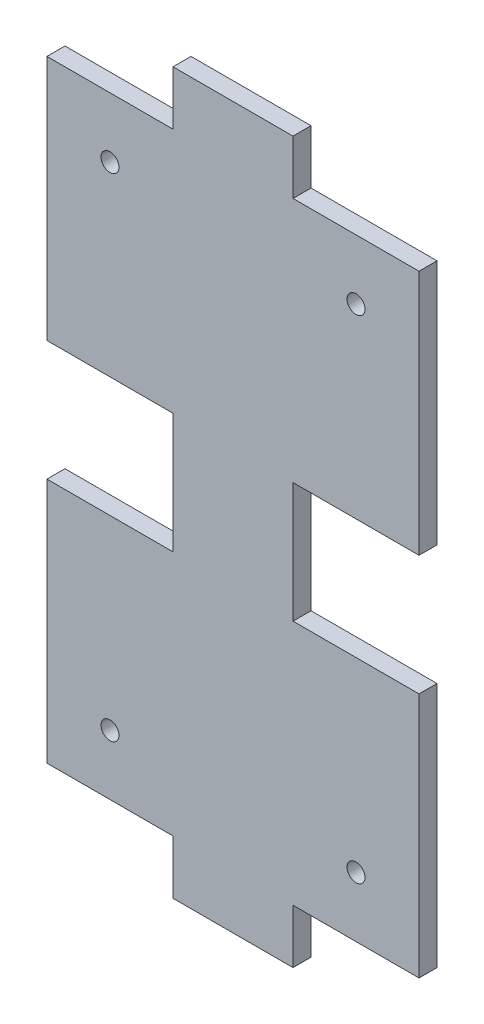
ISO-10303-21;
HEADER;
FILE_DESCRIPTION(('STEP AP214'),'2;1');
FILE_NAME('part.step','',(''),(''),'','','');
FILE_SCHEMA(('AUTOMOTIVE_DESIGN { 1 0 10303 214 1 1 1 1 }'));
ENDSEC;
DATA;
#1=APPLICATION_CONTEXT('core data for automotive mechanical design processes');
#2=APPLICATION_PROTOCOL_DEFINITION('international standard','automotive_design',2000,#1);
#3=PRODUCT_CONTEXT('',#1,'mechanical');
#4=PRODUCT('Part','Part','',(#3));
#5=PRODUCT_RELATED_PRODUCT_CATEGORY('part','',(#4));
#6=PRODUCT_DEFINITION_FORMATION('','',#4);
#7=PRODUCT_DEFINITION_CONTEXT('part definition',#1,'design');
#8=PRODUCT_DEFINITION('design','',#6,#7);
#9=PRODUCT_DEFINITION_SHAPE('','',#8);
#10=(LENGTH_UNIT() NAMED_UNIT(*) SI_UNIT(.MILLI.,.METRE.));
#11=(NAMED_UNIT(*) PLANE_ANGLE_UNIT() SI_UNIT($,.RADIAN.));
#12=(NAMED_UNIT(*) SI_UNIT($,.STERADIAN.) SOLID_ANGLE_UNIT());
#13=UNCERTAINTY_MEASURE_WITH_UNIT(LENGTH_MEASURE(1.E-05),#10,'distance_accuracy_value','');
#14=(GEOMETRIC_REPRESENTATION_CONTEXT(3) GLOBAL_UNCERTAINTY_ASSIGNED_CONTEXT((#13)) GLOBAL_UNIT_ASSIGNED_CONTEXT((#10,
#11,#12)) REPRESENTATION_CONTEXT('',''));
#15=CARTESIAN_POINT('',(0.,0.,0.));
#16=DIRECTION('',(0.,0.,1.));
#17=DIRECTION('',(1.,0.,0.));
#18=AXIS2_PLACEMENT_3D('',#15,#16,#17);
#19=CARTESIAN_POINT('',(31.,0.,3.));
#20=DIRECTION('',(-1.,0.,0.));
#21=DIRECTION('',(0.,0.,1.));
#22=AXIS2_PLACEMENT_3D('',#19,#20,#21);
#23=PLANE('',#22);
#24=DIRECTION('',(0.,1.,0.));
#25=VECTOR('',#24,1.);
#26=CARTESIAN_POINT('',(31.,0.,0.));
#27=LINE('',#26,#25);
#28=CARTESIAN_POINT('',(31.,13.4085885049134,0.));
#29=VERTEX_POINT('',#28);
#30=CARTESIAN_POINT('',(31.,54.4085885049134,0.));
#31=VERTEX_POINT('',#30);
#32=EDGE_CURVE('E221',#29,#31,#27,.T.);
#33=ORIENTED_EDGE('',*,*,#32,.T.);
#34=DIRECTION('',(0.,0.,-1.));
#35=VECTOR('',#34,1.);
#36=CARTESIAN_POINT('',(31.,54.4085885049134,3.));
#37=LINE('',#36,#35);
#38=CARTESIAN_POINT('',(31.,54.4085885049134,3.));
#39=VERTEX_POINT('',#38);
#40=EDGE_CURVE('E11',#39,#31,#37,.T.);
#41=ORIENTED_EDGE('',*,*,#40,.F.);
#42=DIRECTION('',(0.,1.,0.));
#43=VECTOR('',#42,1.);
#44=CARTESIAN_POINT('',(31.,0.,3.));
#45=LINE('',#44,#43);
#46=CARTESIAN_POINT('',(31.,13.4085885049134,3.));
#47=VERTEX_POINT('',#46);
#48=EDGE_CURVE('E362',#47,#39,#45,.T.);
#49=ORIENTED_EDGE('',*,*,#48,.F.);
#50=DIRECTION('',(0.,0.,-1.));
#51=VECTOR('',#50,1.);
#52=CARTESIAN_POINT('',(31.,13.4085885049134,3.));
#53=LINE('',#52,#51);
#54=EDGE_CURVE('E217',#47,#29,#53,.T.);
#55=ORIENTED_EDGE('',*,*,#54,.T.);
#56=EDGE_LOOP('',(#33,#41,#49,#55));
#57=FACE_BOUND('',#56,.T.);
#58=ADVANCED_FACE('F35',(#57),#23,.F.);
#59=CARTESIAN_POINT('',(0.,54.4085885049134,3.));
#60=DIRECTION('',(0.,-1.,0.));
#61=DIRECTION('',(1.,0.,0.));
#62=AXIS2_PLACEMENT_3D('',#59,#60,#61);
#63=PLANE('',#62);
#64=DIRECTION('',(-1.,0.,0.));
#65=VECTOR('',#64,1.);
#66=CARTESIAN_POINT('',(0.,54.4085885049134,0.));
#67=LINE('',#66,#65);
#68=CARTESIAN_POINT('',(10.,54.4085885049134,0.));
#69=VERTEX_POINT('',#68);
#70=EDGE_CURVE('E224',#31,#69,#67,.T.);
#71=ORIENTED_EDGE('',*,*,#70,.T.);
#72=DIRECTION('',(0.,0.,-1.));
#73=VECTOR('',#72,1.);
#74=CARTESIAN_POINT('',(10.,54.4085885049134,3.));
#75=LINE('',#74,#73);
#76=CARTESIAN_POINT('',(10.,54.4085885049134,3.));
#77=VERTEX_POINT('',#76);
#78=EDGE_CURVE('E44',#77,#69,#75,.T.);
#79=ORIENTED_EDGE('',*,*,#78,.F.);
#80=DIRECTION('',(-1.,0.,0.));
#81=VECTOR('',#80,1.);
#82=CARTESIAN_POINT('',(0.,54.4085885049134,3.));
#83=LINE('',#82,#81);
#84=EDGE_CURVE('E130',#39,#77,#83,.T.);
#85=ORIENTED_EDGE('',*,*,#84,.F.);
#86=ORIENTED_EDGE('',*,*,#40,.T.);
#87=EDGE_LOOP('',(#71,#79,#85,#86));
#88=FACE_BOUND('',#87,.T.);
#89=ADVANCED_FACE('F382',(#88),#63,.F.);
#90=CARTESIAN_POINT('',(10.,0.,3.));
#91=DIRECTION('',(-1.,0.,0.));
#92=DIRECTION('',(0.,0.,1.));
#93=AXIS2_PLACEMENT_3D('',#90,#91,#92);
#94=PLANE('',#93);
#95=DIRECTION('',(0.,1.,0.));
#96=VECTOR('',#95,1.);
#97=CARTESIAN_POINT('',(10.,0.,0.));
#98=LINE('',#97,#96);
#99=CARTESIAN_POINT('',(10.,63.4085885049134,0.));
#100=VERTEX_POINT('',#99);
#101=EDGE_CURVE('E226',#69,#100,#98,.T.);
#102=ORIENTED_EDGE('',*,*,#101,.T.);
#103=DIRECTION('',(0.,0.,-1.));
#104=VECTOR('',#103,1.);
#105=CARTESIAN_POINT('',(10.,63.4085885049134,3.));
#106=LINE('',#105,#104);
#107=CARTESIAN_POINT('',(10.,63.4085885049134,3.));
#108=VERTEX_POINT('',#107);
#109=EDGE_CURVE('E307',#108,#100,#106,.T.);
#110=ORIENTED_EDGE('',*,*,#109,.F.);
#111=DIRECTION('',(0.,1.,0.));
#112=VECTOR('',#111,1.);
#113=CARTESIAN_POINT('',(10.,0.,3.));
#114=LINE('',#113,#112);
#115=EDGE_CURVE('E195',#77,#108,#114,.T.);
#116=ORIENTED_EDGE('',*,*,#115,.F.);
#117=ORIENTED_EDGE('',*,*,#78,.T.);
#118=EDGE_LOOP('',(#102,#110,#116,#117));
#119=FACE_BOUND('',#118,.T.);
#120=ADVANCED_FACE('F313',(#119),#94,.F.);
#121=CARTESIAN_POINT('',(0.,63.4085885049134,3.));
#122=DIRECTION('',(0.,-1.,0.));
#123=DIRECTION('',(0.,0.,-1.));
#124=AXIS2_PLACEMENT_3D('',#121,#122,#123);
#125=PLANE('',#124);
#126=DIRECTION('',(-1.,0.,0.));
#127=VECTOR('',#126,1.);
#128=CARTESIAN_POINT('',(0.,63.4085885049134,0.));
#129=LINE('',#128,#127);
#130=CARTESIAN_POINT('',(-10.,63.4085885049134,0.));
#131=VERTEX_POINT('',#130);
#132=EDGE_CURVE('E228',#100,#131,#129,.T.);
#133=ORIENTED_EDGE('',*,*,#132,.T.);
#134=DIRECTION('',(0.,0.,-1.));
#135=VECTOR('',#134,1.);
#136=CARTESIAN_POINT('',(-10.,63.4085885049134,3.));
#137=LINE('',#136,#135);
#138=CARTESIAN_POINT('',(-10.,63.4085885049134,3.));
#139=VERTEX_POINT('',#138);
#140=EDGE_CURVE('E304',#139,#131,#137,.T.);
#141=ORIENTED_EDGE('',*,*,#140,.F.);
#142=DIRECTION('',(-1.,0.,0.));
#143=VECTOR('',#142,1.);
#144=CARTESIAN_POINT('',(0.,63.4085885049134,3.));
#145=LINE('',#144,#143);
#146=EDGE_CURVE('E333',#108,#139,#145,.T.);
#147=ORIENTED_EDGE('',*,*,#146,.F.);
#148=ORIENTED_EDGE('',*,*,#109,.T.);
#149=EDGE_LOOP('',(#133,#141,#147,#148));
#150=FACE_BOUND('',#149,.T.);
#151=ADVANCED_FACE('F323',(#150),#125,.F.);
#152=CARTESIAN_POINT('',(-10.,0.,3.));
#153=DIRECTION('',(1.,0.,0.));
#154=DIRECTION('',(0.,0.,-1.));
#155=AXIS2_PLACEMENT_3D('',#152,#153,#154);
#156=PLANE('',#155);
#157=DIRECTION('',(0.,-1.,0.));
#158=VECTOR('',#157,1.);
#159=CARTESIAN_POINT('',(-10.,0.,0.));
#160=LINE('',#159,#158);
#161=CARTESIAN_POINT('',(-10.,54.4085885049134,0.));
#162=VERTEX_POINT('',#161);
#163=EDGE_CURVE('E231',#131,#162,#160,.T.);
#164=ORIENTED_EDGE('',*,*,#163,.T.);
#165=DIRECTION('',(0.,0.,-1.));
#166=VECTOR('',#165,1.);
#167=CARTESIAN_POINT('',(-10.,54.4085885049134,3.));
#168=LINE('',#167,#166);
#169=CARTESIAN_POINT('',(-10.,54.4085885049134,3.));
#170=VERTEX_POINT('',#169);
#171=EDGE_CURVE('E302',#170,#162,#168,.T.);
#172=ORIENTED_EDGE('',*,*,#171,.F.);
#173=DIRECTION('',(0.,-1.,0.));
#174=VECTOR('',#173,1.);
#175=CARTESIAN_POINT('',(-10.,0.,3.));
#176=LINE('',#175,#174);
#177=EDGE_CURVE('E329',#139,#170,#176,.T.);
#178=ORIENTED_EDGE('',*,*,#177,.F.);
#179=ORIENTED_EDGE('',*,*,#140,.T.);
#180=EDGE_LOOP('',(#164,#172,#178,#179));
#181=FACE_BOUND('',#180,.T.);
#182=ADVANCED_FACE('F327',(#181),#156,.F.);
#183=CARTESIAN_POINT('',(0.,54.4085885049134,3.));
#184=DIRECTION('',(0.,1.,0.));
#185=DIRECTION('',(0.,0.,1.));
#186=AXIS2_PLACEMENT_3D('',#183,#184,#185);
#187=PLANE('',#186);
#188=DIRECTION('',(1.,0.,0.));
#189=VECTOR('',#188,1.);
#190=CARTESIAN_POINT('',(0.,54.4085885049134,0.));
#191=LINE('',#190,#189);
#192=CARTESIAN_POINT('',(-31.,54.4085885049134,0.));
#193=VERTEX_POINT('',#192);
#194=EDGE_CURVE('E234',#193,#162,#191,.T.);
#195=ORIENTED_EDGE('',*,*,#194,.F.);
#196=DIRECTION('',(0.,0.,-1.));
#197=VECTOR('',#196,1.);
#198=CARTESIAN_POINT('',(-31.,54.4085885049134,3.));
#199=LINE('',#198,#197);
#200=CARTESIAN_POINT('',(-31.,54.4085885049134,3.));
#201=VERTEX_POINT('',#200);
#202=EDGE_CURVE('E300',#201,#193,#199,.T.);
#203=ORIENTED_EDGE('',*,*,#202,.F.);
#204=DIRECTION('',(1.,0.,0.));
#205=VECTOR('',#204,1.);
#206=CARTESIAN_POINT('',(0.,54.4085885049134,3.));
#207=LINE('',#206,#205);
#208=EDGE_CURVE('E332',#201,#170,#207,.T.);
#209=ORIENTED_EDGE('',*,*,#208,.T.);
#210=ORIENTED_EDGE('',*,*,#171,.T.);
#211=EDGE_LOOP('',(#195,#203,#209,#210));
#212=FACE_BOUND('',#211,.T.);
#213=ADVANCED_FACE('F391',(#212),#187,.T.);
#214=CARTESIAN_POINT('',(-31.,0.,3.));
#215=DIRECTION('',(-1.,0.,0.));
#216=DIRECTION('',(0.,0.,1.));
#217=AXIS2_PLACEMENT_3D('',#214,#215,#216);
#218=PLANE('',#217);
#219=DIRECTION('',(0.,1.,0.));
#220=VECTOR('',#219,1.);
#221=CARTESIAN_POINT('',(-31.,0.,0.));
#222=LINE('',#221,#220);
#223=CARTESIAN_POINT('',(-31.,13.4085885049134,0.));
#224=VERTEX_POINT('',#223);
#225=EDGE_CURVE('E239',#224,#193,#222,.T.);
#226=ORIENTED_EDGE('',*,*,#225,.F.);
#227=DIRECTION('',(0.,0.,-1.));
#228=VECTOR('',#227,1.);
#229=CARTESIAN_POINT('',(-31.,13.4085885049134,3.));
#230=LINE('',#229,#228);
#231=CARTESIAN_POINT('',(-31.,13.4085885049134,3.));
#232=VERTEX_POINT('',#231);
#233=EDGE_CURVE('E298',#232,#224,#230,.T.);
#234=ORIENTED_EDGE('',*,*,#233,.F.);
#235=DIRECTION('',(0.,1.,0.));
#236=VECTOR('',#235,1.);
#237=CARTESIAN_POINT('',(-31.,0.,3.));
#238=LINE('',#237,#236);
#239=EDGE_CURVE('E337',#232,#201,#238,.T.);
#240=ORIENTED_EDGE('',*,*,#239,.T.);
#241=ORIENTED_EDGE('',*,*,#202,.T.);
#242=EDGE_LOOP('',(#226,#234,#240,#241));
#243=FACE_BOUND('',#242,.T.);
#244=ADVANCED_FACE('F394',(#243),#218,.T.);
#245=CARTESIAN_POINT('',(0.,13.4085885049134,3.));
#246=DIRECTION('',(0.,-1.,0.));
#247=DIRECTION('',(1.,0.,0.));
#248=AXIS2_PLACEMENT_3D('',#245,#246,#247);
#249=PLANE('',#248);
#250=DIRECTION('',(-1.,0.,0.));
#251=VECTOR('',#250,1.);
#252=CARTESIAN_POINT('',(0.,13.4085885049134,0.));
#253=LINE('',#252,#251);
#254=CARTESIAN_POINT('',(-10.,13.4085885049134,0.));
#255=VERTEX_POINT('',#254);
#256=EDGE_CURVE('E242',#255,#224,#253,.T.);
#257=ORIENTED_EDGE('',*,*,#256,.F.);
#258=DIRECTION('',(0.,0.,-1.));
#259=VECTOR('',#258,1.);
#260=CARTESIAN_POINT('',(-10.,13.4085885049134,3.));
#261=LINE('',#260,#259);
#262=CARTESIAN_POINT('',(-10.,13.4085885049134,3.));
#263=VERTEX_POINT('',#262);
#264=EDGE_CURVE('E296',#263,#255,#261,.T.);
#265=ORIENTED_EDGE('',*,*,#264,.F.);
#266=DIRECTION('',(-1.,0.,0.));
#267=VECTOR('',#266,1.);
#268=CARTESIAN_POINT('',(0.,13.4085885049134,3.));
#269=LINE('',#268,#267);
#270=EDGE_CURVE('E343',#263,#232,#269,.T.);
#271=ORIENTED_EDGE('',*,*,#270,.T.);
#272=ORIENTED_EDGE('',*,*,#233,.T.);
#273=EDGE_LOOP('',(#257,#265,#271,#272));
#274=FACE_BOUND('',#273,.T.);
#275=ADVANCED_FACE('F398',(#274),#249,.T.);
#276=CARTESIAN_POINT('',(-10.,-6.59141149508663,0.));
#277=VERTEX_POINT('',#276);
#278=EDGE_CURVE('E236',#255,#277,#160,.T.);
#279=ORIENTED_EDGE('',*,*,#278,.T.);
#280=DIRECTION('',(0.,0.,-1.));
#281=VECTOR('',#280,1.);
#282=CARTESIAN_POINT('',(-10.,-6.59141149508663,3.));
#283=LINE('',#282,#281);
#284=CARTESIAN_POINT('',(-10.,-6.59141149508663,3.));
#285=VERTEX_POINT('',#284);
#286=EDGE_CURVE('E293',#285,#277,#283,.T.);
#287=ORIENTED_EDGE('',*,*,#286,.F.);
#288=EDGE_CURVE('E336',#263,#285,#176,.T.);
#289=ORIENTED_EDGE('',*,*,#288,.F.);
#290=ORIENTED_EDGE('',*,*,#264,.T.);
#291=EDGE_LOOP('',(#279,#287,#289,#290));
#292=FACE_BOUND('',#291,.T.);
#293=ADVANCED_FACE('F402',(#292),#156,.F.);
#294=CARTESIAN_POINT('',(0.,-6.59141149508663,3.));
#295=DIRECTION('',(0.,-1.,0.));
#296=DIRECTION('',(1.,0.,0.));
#297=AXIS2_PLACEMENT_3D('',#294,#295,#296);
#298=PLANE('',#297);
#299=DIRECTION('',(-1.,0.,0.));
#300=VECTOR('',#299,1.);
#301=CARTESIAN_POINT('',(0.,-6.59141149508663,0.));
#302=LINE('',#301,#300);
#303=CARTESIAN_POINT('',(-31.,-6.59141149508663,0.));
#304=VERTEX_POINT('',#303);
#305=EDGE_CURVE('E245',#277,#304,#302,.T.);
#306=ORIENTED_EDGE('',*,*,#305,.T.);
#307=DIRECTION('',(0.,0.,-1.));
#308=VECTOR('',#307,1.);
#309=CARTESIAN_POINT('',(-31.,-6.59141149508663,3.));
#310=LINE('',#309,#308);
#311=CARTESIAN_POINT('',(-31.,-6.59141149508663,3.));
#312=VERTEX_POINT('',#311);
#313=EDGE_CURVE('E290',#312,#304,#310,.T.);
#314=ORIENTED_EDGE('',*,*,#313,.F.);
#315=DIRECTION('',(-1.,0.,0.));
#316=VECTOR('',#315,1.);
#317=CARTESIAN_POINT('',(0.,-6.59141149508663,3.));
#318=LINE('',#317,#316);
#319=EDGE_CURVE('E342',#285,#312,#318,.T.);
#320=ORIENTED_EDGE('',*,*,#319,.F.);
#321=ORIENTED_EDGE('',*,*,#286,.T.);
#322=EDGE_LOOP('',(#306,#314,#320,#321));
#323=FACE_BOUND('',#322,.T.);
#324=ADVANCED_FACE('F403',(#323),#298,.F.);
#325=CARTESIAN_POINT('',(-31.,0.,3.));
#326=DIRECTION('',(1.,0.,0.));
#327=DIRECTION('',(0.,0.,-1.));
#328=AXIS2_PLACEMENT_3D('',#325,#326,#327);
#329=PLANE('',#328);
#330=DIRECTION('',(0.,-1.,0.));
#331=VECTOR('',#330,1.);
#332=CARTESIAN_POINT('',(-31.,0.,0.));
#333=LINE('',#332,#331);
#334=CARTESIAN_POINT('',(-31.,-47.5914114950866,0.));
#335=VERTEX_POINT('',#334);
#336=EDGE_CURVE('E247',#304,#335,#333,.T.);
#337=ORIENTED_EDGE('',*,*,#336,.T.);
#338=DIRECTION('',(0.,0.,-1.));
#339=VECTOR('',#338,1.);
#340=CARTESIAN_POINT('',(-31.,-47.5914114950866,3.));
#341=LINE('',#340,#339);
#342=CARTESIAN_POINT('',(-31.,-47.5914114950866,3.));
#343=VERTEX_POINT('',#342);
#344=EDGE_CURVE('E287',#343,#335,#341,.T.);
#345=ORIENTED_EDGE('',*,*,#344,.F.);
#346=DIRECTION('',(0.,-1.,0.));
#347=VECTOR('',#346,1.);
#348=CARTESIAN_POINT('',(-31.,0.,3.));
#349=LINE('',#348,#347);
#350=EDGE_CURVE('E347',#312,#343,#349,.T.);
#351=ORIENTED_EDGE('',*,*,#350,.F.);
#352=ORIENTED_EDGE('',*,*,#313,.T.);
#353=EDGE_LOOP('',(#337,#345,#351,#352));
#354=FACE_BOUND('',#353,.T.);
#355=ADVANCED_FACE('F406',(#354),#329,.F.);
#356=CARTESIAN_POINT('',(0.,-47.5914114950866,3.));
#357=DIRECTION('',(0.,1.,0.));
#358=DIRECTION('',(0.,0.,1.));
#359=AXIS2_PLACEMENT_3D('',#356,#357,#358);
#360=PLANE('',#359);
#361=DIRECTION('',(1.,0.,0.));
#362=VECTOR('',#361,1.);
#363=CARTESIAN_POINT('',(0.,-47.5914114950866,0.));
#364=LINE('',#363,#362);
#365=CARTESIAN_POINT('',(-10.,-47.5914114950866,0.));
#366=VERTEX_POINT('',#365);
#367=EDGE_CURVE('E249',#335,#366,#364,.T.);
#368=ORIENTED_EDGE('',*,*,#367,.T.);
#369=DIRECTION('',(0.,0.,-1.));
#370=VECTOR('',#369,1.);
#371=CARTESIAN_POINT('',(-10.,-47.5914114950866,3.));
#372=LINE('',#371,#370);
#373=CARTESIAN_POINT('',(-10.,-47.5914114950866,3.));
#374=VERTEX_POINT('',#373);
#375=EDGE_CURVE('E284',#374,#366,#372,.T.);
#376=ORIENTED_EDGE('',*,*,#375,.F.);
#377=DIRECTION('',(1.,0.,0.));
#378=VECTOR('',#377,1.);
#379=CARTESIAN_POINT('',(0.,-47.5914114950866,3.));
#380=LINE('',#379,#378);
#381=EDGE_CURVE('E341',#343,#374,#380,.T.);
#382=ORIENTED_EDGE('',*,*,#381,.F.);
#383=ORIENTED_EDGE('',*,*,#344,.T.);
#384=EDGE_LOOP('',(#368,#376,#382,#383));
#385=FACE_BOUND('',#384,.T.);
#386=ADVANCED_FACE('F410',(#385),#360,.F.);
#387=CARTESIAN_POINT('',(-10.,-56.5914114950866,0.));
#388=VERTEX_POINT('',#387);
#389=EDGE_CURVE('E235',#366,#388,#160,.T.);
#390=ORIENTED_EDGE('',*,*,#389,.T.);
#391=DIRECTION('',(0.,0.,-1.));
#392=VECTOR('',#391,1.);
#393=CARTESIAN_POINT('',(-10.,-56.5914114950866,3.));
#394=LINE('',#393,#392);
#395=CARTESIAN_POINT('',(-10.,-56.5914114950866,3.));
#396=VERTEX_POINT('',#395);
#397=EDGE_CURVE('E281',#396,#388,#394,.T.);
#398=ORIENTED_EDGE('',*,*,#397,.F.);
#399=EDGE_CURVE('E335',#374,#396,#176,.T.);
#400=ORIENTED_EDGE('',*,*,#399,.F.);
#401=ORIENTED_EDGE('',*,*,#375,.T.);
#402=EDGE_LOOP('',(#390,#398,#400,#401));
#403=FACE_BOUND('',#402,.T.);
#404=ADVANCED_FACE('F414',(#403),#156,.F.);
#405=CARTESIAN_POINT('',(0.,-56.5914114950866,3.));
#406=DIRECTION('',(0.,1.,0.));
#407=DIRECTION('',(0.,0.,1.));
#408=AXIS2_PLACEMENT_3D('',#405,#406,#407);
#409=PLANE('',#408);
#410=DIRECTION('',(1.,0.,0.));
#411=VECTOR('',#410,1.);
#412=CARTESIAN_POINT('',(0.,-56.5914114950866,0.));
#413=LINE('',#412,#411);
#414=CARTESIAN_POINT('',(10.,-56.5914114950866,0.));
#415=VERTEX_POINT('',#414);
#416=EDGE_CURVE('E251',#388,#415,#413,.T.);
#417=ORIENTED_EDGE('',*,*,#416,.T.);
#418=DIRECTION('',(0.,0.,-1.));
#419=VECTOR('',#418,1.);
#420=CARTESIAN_POINT('',(10.,-56.5914114950866,3.));
#421=LINE('',#420,#419);
#422=CARTESIAN_POINT('',(10.,-56.5914114950866,3.));
#423=VERTEX_POINT('',#422);
#424=EDGE_CURVE('E278',#423,#415,#421,.T.);
#425=ORIENTED_EDGE('',*,*,#424,.F.);
#426=DIRECTION('',(1.,0.,0.));
#427=VECTOR('',#426,1.);
#428=CARTESIAN_POINT('',(0.,-56.5914114950866,3.));
#429=LINE('',#428,#427);
#430=EDGE_CURVE('E340',#396,#423,#429,.T.);
#431=ORIENTED_EDGE('',*,*,#430,.F.);
#432=ORIENTED_EDGE('',*,*,#397,.T.);
#433=EDGE_LOOP('',(#417,#425,#431,#432));
#434=FACE_BOUND('',#433,.T.);
#435=ADVANCED_FACE('F418',(#434),#409,.F.);
#436=CARTESIAN_POINT('',(10.,-47.5914114950866,0.));
#437=VERTEX_POINT('',#436);
#438=EDGE_CURVE('E229',#415,#437,#98,.T.);
#439=ORIENTED_EDGE('',*,*,#438,.T.);
#440=DIRECTION('',(0.,0.,-1.));
#441=VECTOR('',#440,1.);
#442=CARTESIAN_POINT('',(10.,-47.5914114950866,3.));
#443=LINE('',#442,#441);
#444=CARTESIAN_POINT('',(10.,-47.5914114950866,3.));
#445=VERTEX_POINT('',#444);
#446=EDGE_CURVE('E276',#445,#437,#443,.T.);
#447=ORIENTED_EDGE('',*,*,#446,.F.);
#448=EDGE_CURVE('E194',#423,#445,#114,.T.);
#449=ORIENTED_EDGE('',*,*,#448,.F.);
#450=ORIENTED_EDGE('',*,*,#424,.T.);
#451=EDGE_LOOP('',(#439,#447,#449,#450));
#452=FACE_BOUND('',#451,.T.);
#453=ADVANCED_FACE('F422',(#452),#94,.F.);
#454=CARTESIAN_POINT('',(0.,-47.5914114950866,3.));
#455=DIRECTION('',(0.,-1.,0.));
#456=DIRECTION('',(0.,0.,-1.));
#457=AXIS2_PLACEMENT_3D('',#454,#455,#456);
#458=PLANE('',#457);
#459=DIRECTION('',(-1.,0.,0.));
#460=VECTOR('',#459,1.);
#461=CARTESIAN_POINT('',(0.,-47.5914114950866,0.));
#462=LINE('',#461,#460);
#463=CARTESIAN_POINT('',(31.,-47.5914114950866,0.));
#464=VERTEX_POINT('',#463);
#465=EDGE_CURVE('E253',#464,#437,#462,.T.);
#466=ORIENTED_EDGE('',*,*,#465,.F.);
#467=DIRECTION('',(0.,0.,-1.));
#468=VECTOR('',#467,1.);
#469=CARTESIAN_POINT('',(31.,-47.5914114950866,3.));
#470=LINE('',#469,#468);
#471=CARTESIAN_POINT('',(31.,-47.5914114950866,3.));
#472=VERTEX_POINT('',#471);
#473=EDGE_CURVE('E274',#472,#464,#470,.T.);
#474=ORIENTED_EDGE('',*,*,#473,.F.);
#475=DIRECTION('',(-1.,0.,0.));
#476=VECTOR('',#475,1.);
#477=CARTESIAN_POINT('',(0.,-47.5914114950866,3.));
#478=LINE('',#477,#476);
#479=EDGE_CURVE('E203',#472,#445,#478,.T.);
#480=ORIENTED_EDGE('',*,*,#479,.T.);
#481=ORIENTED_EDGE('',*,*,#446,.T.);
#482=EDGE_LOOP('',(#466,#474,#480,#481));
#483=FACE_BOUND('',#482,.T.);
#484=ADVANCED_FACE('F424',(#483),#458,.T.);
#485=CARTESIAN_POINT('',(31.,0.,3.));
#486=DIRECTION('',(1.,0.,0.));
#487=DIRECTION('',(0.,0.,-1.));
#488=AXIS2_PLACEMENT_3D('',#485,#486,#487);
#489=PLANE('',#488);
#490=DIRECTION('',(0.,-1.,0.));
#491=VECTOR('',#490,1.);
#492=CARTESIAN_POINT('',(31.,0.,0.));
#493=LINE('',#492,#491);
#494=CARTESIAN_POINT('',(31.,-6.59141149508663,0.));
#495=VERTEX_POINT('',#494);
#496=EDGE_CURVE('E256',#495,#464,#493,.T.);
#497=ORIENTED_EDGE('',*,*,#496,.F.);
#498=DIRECTION('',(0.,0.,-1.));
#499=VECTOR('',#498,1.);
#500=CARTESIAN_POINT('',(31.,-6.59141149508663,3.));
#501=LINE('',#500,#499);
#502=CARTESIAN_POINT('',(31.,-6.59141149508663,3.));
#503=VERTEX_POINT('',#502);
#504=EDGE_CURVE('E188',#503,#495,#501,.T.);
#505=ORIENTED_EDGE('',*,*,#504,.F.);
#506=DIRECTION('',(0.,-1.,0.));
#507=VECTOR('',#506,1.);
#508=CARTESIAN_POINT('',(31.,0.,3.));
#509=LINE('',#508,#507);
#510=EDGE_CURVE('E201',#503,#472,#509,.T.);
#511=ORIENTED_EDGE('',*,*,#510,.T.);
#512=ORIENTED_EDGE('',*,*,#473,.T.);
#513=EDGE_LOOP('',(#497,#505,#511,#512));
#514=FACE_BOUND('',#513,.T.);
#515=ADVANCED_FACE('F427',(#514),#489,.T.);
#516=CARTESIAN_POINT('',(0.,-6.59141149508664,3.));
#517=DIRECTION('',(0.,1.,0.));
#518=DIRECTION('',(-1.,0.,0.));
#519=AXIS2_PLACEMENT_3D('',#516,#517,#518);
#520=PLANE('',#519);
#521=DIRECTION('',(1.,0.,0.));
#522=VECTOR('',#521,1.);
#523=CARTESIAN_POINT('',(0.,-6.59141149508664,0.));
#524=LINE('',#523,#522);
#525=CARTESIAN_POINT('',(10.,-6.59141149508663,0.));
#526=VERTEX_POINT('',#525);
#527=EDGE_CURVE('E187',#526,#495,#524,.T.);
#528=ORIENTED_EDGE('',*,*,#527,.F.);
#529=DIRECTION('',(0.,0.,-1.));
#530=VECTOR('',#529,1.);
#531=CARTESIAN_POINT('',(10.,-6.59141149508663,3.));
#532=LINE('',#531,#530);
#533=CARTESIAN_POINT('',(10.,-6.59141149508663,3.));
#534=VERTEX_POINT('',#533);
#535=EDGE_CURVE('E181',#534,#526,#532,.T.);
#536=ORIENTED_EDGE('',*,*,#535,.F.);
#537=DIRECTION('',(1.,0.,0.));
#538=VECTOR('',#537,1.);
#539=CARTESIAN_POINT('',(0.,-6.59141149508664,3.));
#540=LINE('',#539,#538);
#541=EDGE_CURVE('E185',#534,#503,#540,.T.);
#542=ORIENTED_EDGE('',*,*,#541,.T.);
#543=ORIENTED_EDGE('',*,*,#504,.T.);
#544=EDGE_LOOP('',(#528,#536,#542,#543));
#545=FACE_BOUND('',#544,.T.);
#546=ADVANCED_FACE('F183',(#545),#520,.T.);
#547=CARTESIAN_POINT('',(10.,13.4085885049134,0.));
#548=VERTEX_POINT('',#547);
#549=EDGE_CURVE('E116',#526,#548,#98,.T.);
#550=ORIENTED_EDGE('',*,*,#549,.T.);
#551=DIRECTION('',(0.,0.,-1.));
#552=VECTOR('',#551,1.);
#553=CARTESIAN_POINT('',(10.,13.4085885049134,3.));
#554=LINE('',#553,#552);
#555=CARTESIAN_POINT('',(10.,13.4085885049134,3.));
#556=VERTEX_POINT('',#555);
#557=EDGE_CURVE('E189',#556,#548,#554,.T.);
#558=ORIENTED_EDGE('',*,*,#557,.F.);
#559=EDGE_CURVE('E191',#534,#556,#114,.T.);
#560=ORIENTED_EDGE('',*,*,#559,.F.);
#561=ORIENTED_EDGE('',*,*,#535,.T.);
#562=EDGE_LOOP('',(#550,#558,#560,#561));
#563=FACE_BOUND('',#562,.T.);
#564=ADVANCED_FACE('F192',(#563),#94,.F.);
#565=CARTESIAN_POINT('',(-20.5,-37.5914114950866,3.));
#566=DIRECTION('',(0.,0.,-1.));
#567=DIRECTION('',(-1.,0.,0.));
#568=AXIS2_PLACEMENT_3D('',#565,#566,#567);
#569=CYLINDRICAL_SURFACE('',#568,1.5);
#570=CARTESIAN_POINT('',(-20.5,-37.5914114950866,3.));
#571=DIRECTION('',(0.,0.,1.));
#572=DIRECTION('',(1.,0.,0.));
#573=AXIS2_PLACEMENT_3D('',#570,#571,#572);
#574=CIRCLE('',#573,1.5);
#575=CARTESIAN_POINT('',(-19.,-37.5914114950866,3.));
#576=VERTEX_POINT('',#575);
#577=EDGE_CURVE('E211',#576,#576,#574,.T.);
#578=ORIENTED_EDGE('',*,*,#577,.T.);
#579=EDGE_LOOP('',(#578));
#580=FACE_BOUND('',#579,.T.);
#581=CARTESIAN_POINT('',(-20.5,-37.5914114950866,0.));
#582=DIRECTION('',(0.,0.,1.));
#583=DIRECTION('',(1.,0.,0.));
#584=AXIS2_PLACEMENT_3D('',#581,#582,#583);
#585=CIRCLE('',#584,1.5);
#586=CARTESIAN_POINT('',(-19.,-37.5914114950866,0.));
#587=VERTEX_POINT('',#586);
#588=EDGE_CURVE('E264',#587,#587,#585,.T.);
#589=ORIENTED_EDGE('',*,*,#588,.F.);
#590=EDGE_LOOP('',(#589));
#591=FACE_BOUND('',#590,.T.);
#592=ADVANCED_FACE('F435',(#580,#591),#569,.F.);
#593=CARTESIAN_POINT('',(20.5,-37.5914114950866,3.));
#594=DIRECTION('',(0.,0.,-1.));
#595=DIRECTION('',(-1.,0.,0.));
#596=AXIS2_PLACEMENT_3D('',#593,#594,#595);
#597=CYLINDRICAL_SURFACE('',#596,1.5);
#598=CARTESIAN_POINT('',(20.5,-37.5914114950866,3.));
#599=DIRECTION('',(0.,0.,1.));
#600=DIRECTION('',(1.,0.,0.));
#601=AXIS2_PLACEMENT_3D('',#598,#599,#600);
#602=CIRCLE('',#601,1.5);
#603=CARTESIAN_POINT('',(22.,-37.5914114950866,3.));
#604=VERTEX_POINT('',#603);
#605=EDGE_CURVE('E208',#604,#604,#602,.T.);
#606=ORIENTED_EDGE('',*,*,#605,.T.);
#607=EDGE_LOOP('',(#606));
#608=FACE_BOUND('',#607,.T.);
#609=CARTESIAN_POINT('',(20.5,-37.5914114950866,0.));
#610=DIRECTION('',(0.,0.,1.));
#611=DIRECTION('',(1.,0.,0.));
#612=AXIS2_PLACEMENT_3D('',#609,#610,#611);
#613=CIRCLE('',#612,1.5);
#614=CARTESIAN_POINT('',(22.,-37.5914114950866,0.));
#615=VERTEX_POINT('',#614);
#616=EDGE_CURVE('E261',#615,#615,#613,.T.);
#617=ORIENTED_EDGE('',*,*,#616,.F.);
#618=EDGE_LOOP('',(#617));
#619=FACE_BOUND('',#618,.T.);
#620=ADVANCED_FACE('F439',(#608,#619),#597,.F.);
#621=CARTESIAN_POINT('',(0.,13.4085885049134,3.));
#622=DIRECTION('',(0.,1.,0.));
#623=DIRECTION('',(-1.,0.,0.));
#624=AXIS2_PLACEMENT_3D('',#621,#622,#623);
#625=PLANE('',#624);
#626=DIRECTION('',(1.,0.,0.));
#627=VECTOR('',#626,1.);
#628=CARTESIAN_POINT('',(0.,13.4085885049134,0.));
#629=LINE('',#628,#627);
#630=EDGE_CURVE('E122',#548,#29,#629,.T.);
#631=ORIENTED_EDGE('',*,*,#630,.T.);
#632=ORIENTED_EDGE('',*,*,#54,.F.);
#633=DIRECTION('',(1.,0.,0.));
#634=VECTOR('',#633,1.);
#635=CARTESIAN_POINT('',(0.,13.4085885049134,3.));
#636=LINE('',#635,#634);
#637=EDGE_CURVE('E52',#556,#47,#636,.T.);
#638=ORIENTED_EDGE('',*,*,#637,.F.);
#639=ORIENTED_EDGE('',*,*,#557,.T.);
#640=EDGE_LOOP('',(#631,#632,#638,#639));
#641=FACE_BOUND('',#640,.T.);
#642=ADVANCED_FACE('F436',(#641),#625,.F.);
#643=CARTESIAN_POINT('',(20.5,44.4085885049134,3.));
#644=DIRECTION('',(0.,0.,-1.));
#645=DIRECTION('',(-1.,0.,0.));
#646=AXIS2_PLACEMENT_3D('',#643,#644,#645);
#647=CYLINDRICAL_SURFACE('',#646,1.5);
#648=CARTESIAN_POINT('',(20.5,44.4085885049134,3.));
#649=DIRECTION('',(0.,0.,1.));
#650=DIRECTION('',(1.,0.,0.));
#651=AXIS2_PLACEMENT_3D('',#648,#649,#650);
#652=CIRCLE('',#651,1.5);
#653=CARTESIAN_POINT('',(22.,44.4085885049134,3.));
#654=VERTEX_POINT('',#653);
#655=EDGE_CURVE('E270',#654,#654,#652,.T.);
#656=ORIENTED_EDGE('',*,*,#655,.T.);
#657=EDGE_LOOP('',(#656));
#658=FACE_BOUND('',#657,.T.);
#659=CARTESIAN_POINT('',(20.5,44.4085885049134,0.));
#660=DIRECTION('',(0.,0.,1.));
#661=DIRECTION('',(1.,0.,0.));
#662=AXIS2_PLACEMENT_3D('',#659,#660,#661);
#663=CIRCLE('',#662,1.5);
#664=CARTESIAN_POINT('',(22.,44.4085885049134,0.));
#665=VERTEX_POINT('',#664);
#666=EDGE_CURVE('E218',#665,#665,#663,.T.);
#667=ORIENTED_EDGE('',*,*,#666,.F.);
#668=EDGE_LOOP('',(#667));
#669=FACE_BOUND('',#668,.T.);
#670=ADVANCED_FACE('F37',(#658,#669),#647,.F.);
#671=CARTESIAN_POINT('',(-20.5,44.4085885049134,3.));
#672=DIRECTION('',(0.,0.,-1.));
#673=DIRECTION('',(-1.,0.,0.));
#674=AXIS2_PLACEMENT_3D('',#671,#672,#673);
#675=CYLINDRICAL_SURFACE('',#674,1.5);
#676=CARTESIAN_POINT('',(-20.5,44.4085885049134,3.));
#677=DIRECTION('',(0.,0.,1.));
#678=DIRECTION('',(1.,0.,0.));
#679=AXIS2_PLACEMENT_3D('',#676,#677,#678);
#680=CIRCLE('',#679,1.5);
#681=CARTESIAN_POINT('',(-19.,44.4085885049134,3.));
#682=VERTEX_POINT('',#681);
#683=EDGE_CURVE('E214',#682,#682,#680,.T.);
#684=ORIENTED_EDGE('',*,*,#683,.T.);
#685=EDGE_LOOP('',(#684));
#686=FACE_BOUND('',#685,.T.);
#687=CARTESIAN_POINT('',(-20.5,44.4085885049134,0.));
#688=DIRECTION('',(0.,0.,1.));
#689=DIRECTION('',(1.,0.,0.));
#690=AXIS2_PLACEMENT_3D('',#687,#688,#689);
#691=CIRCLE('',#690,1.5);
#692=CARTESIAN_POINT('',(-19.,44.4085885049134,0.));
#693=VERTEX_POINT('',#692);
#694=EDGE_CURVE('E267',#693,#693,#691,.T.);
#695=ORIENTED_EDGE('',*,*,#694,.F.);
#696=EDGE_LOOP('',(#695));
#697=FACE_BOUND('',#696,.T.);
#698=ADVANCED_FACE('F371',(#686,#697),#675,.F.);
#699=CARTESIAN_POINT('',(0.,0.,3.));
#700=DIRECTION('',(0.,0.,1.));
#701=DIRECTION('',(1.,0.,0.));
#702=AXIS2_PLACEMENT_3D('',#699,#700,#701);
#703=PLANE('',#702);
#704=ORIENTED_EDGE('',*,*,#655,.F.);
#705=EDGE_LOOP('',(#704));
#706=FACE_BOUND('',#705,.T.);
#707=ORIENTED_EDGE('',*,*,#48,.T.);
#708=ORIENTED_EDGE('',*,*,#84,.T.);
#709=ORIENTED_EDGE('',*,*,#115,.T.);
#710=ORIENTED_EDGE('',*,*,#146,.T.);
#711=ORIENTED_EDGE('',*,*,#177,.T.);
#712=ORIENTED_EDGE('',*,*,#208,.F.);
#713=ORIENTED_EDGE('',*,*,#239,.F.);
#714=ORIENTED_EDGE('',*,*,#270,.F.);
#715=ORIENTED_EDGE('',*,*,#288,.T.);
#716=ORIENTED_EDGE('',*,*,#319,.T.);
#717=ORIENTED_EDGE('',*,*,#350,.T.);
#718=ORIENTED_EDGE('',*,*,#381,.T.);
#719=ORIENTED_EDGE('',*,*,#399,.T.);
#720=ORIENTED_EDGE('',*,*,#430,.T.);
#721=ORIENTED_EDGE('',*,*,#448,.T.);
#722=ORIENTED_EDGE('',*,*,#479,.F.);
#723=ORIENTED_EDGE('',*,*,#510,.F.);
#724=ORIENTED_EDGE('',*,*,#541,.F.);
#725=ORIENTED_EDGE('',*,*,#559,.T.);
#726=ORIENTED_EDGE('',*,*,#637,.T.);
#727=EDGE_LOOP('',(#707,#708,#709,#710,#711,#712,#713,#714,#715,#716,#717,#718,#719,#720,#721,
#722,#723,#724,#725,#726));
#728=FACE_BOUND('',#727,.T.);
#729=ORIENTED_EDGE('',*,*,#605,.F.);
#730=EDGE_LOOP('',(#729));
#731=FACE_BOUND('',#730,.T.);
#732=ORIENTED_EDGE('',*,*,#577,.F.);
#733=EDGE_LOOP('',(#732));
#734=FACE_BOUND('',#733,.T.);
#735=ORIENTED_EDGE('',*,*,#683,.F.);
#736=EDGE_LOOP('',(#735));
#737=FACE_BOUND('',#736,.T.);
#738=ADVANCED_FACE('F197',(#706,#728,#731,#734,#737),#703,.T.);
#739=CARTESIAN_POINT('',(0.,0.,0.));
#740=DIRECTION('',(0.,0.,1.));
#741=DIRECTION('',(1.,0.,0.));
#742=AXIS2_PLACEMENT_3D('',#739,#740,#741);
#743=PLANE('',#742);
#744=ORIENTED_EDGE('',*,*,#666,.T.);
#745=EDGE_LOOP('',(#744));
#746=FACE_BOUND('',#745,.T.);
#747=ORIENTED_EDGE('',*,*,#32,.F.);
#748=ORIENTED_EDGE('',*,*,#630,.F.);
#749=ORIENTED_EDGE('',*,*,#549,.F.);
#750=ORIENTED_EDGE('',*,*,#527,.T.);
#751=ORIENTED_EDGE('',*,*,#496,.T.);
#752=ORIENTED_EDGE('',*,*,#465,.T.);
#753=ORIENTED_EDGE('',*,*,#438,.F.);
#754=ORIENTED_EDGE('',*,*,#416,.F.);
#755=ORIENTED_EDGE('',*,*,#389,.F.);
#756=ORIENTED_EDGE('',*,*,#367,.F.);
#757=ORIENTED_EDGE('',*,*,#336,.F.);
#758=ORIENTED_EDGE('',*,*,#305,.F.);
#759=ORIENTED_EDGE('',*,*,#278,.F.);
#760=ORIENTED_EDGE('',*,*,#256,.T.);
#761=ORIENTED_EDGE('',*,*,#225,.T.);
#762=ORIENTED_EDGE('',*,*,#194,.T.);
#763=ORIENTED_EDGE('',*,*,#163,.F.);
#764=ORIENTED_EDGE('',*,*,#132,.F.);
#765=ORIENTED_EDGE('',*,*,#101,.F.);
#766=ORIENTED_EDGE('',*,*,#70,.F.);
#767=EDGE_LOOP('',(#747,#748,#749,#750,#751,#752,#753,#754,#755,#756,#757,#758,#759,#760,#761,
#762,#763,#764,#765,#766));
#768=FACE_BOUND('',#767,.T.);
#769=ORIENTED_EDGE('',*,*,#616,.T.);
#770=EDGE_LOOP('',(#769));
#771=FACE_BOUND('',#770,.T.);
#772=ORIENTED_EDGE('',*,*,#588,.T.);
#773=EDGE_LOOP('',(#772));
#774=FACE_BOUND('',#773,.T.);
#775=ORIENTED_EDGE('',*,*,#694,.T.);
#776=EDGE_LOOP('',(#775));
#777=FACE_BOUND('',#776,.T.);
#778=ADVANCED_FACE('F318',(#746,#768,#771,#774,#777),#743,.F.);
#779=CLOSED_SHELL('',(#58,#89,#120,#151,#182,#213,#244,#275,#293,#324,#355,#386,#404,#435,#453,
#484,#515,#546,#564,#592,#620,#642,#670,#698,#738,#778));
#780=MANIFOLD_SOLID_BREP('B2',#779);
#781=ADVANCED_BREP_SHAPE_REPRESENTATION('',(#18,#780),#14);
#782=SHAPE_DEFINITION_REPRESENTATION(#9,#781);
ENDSEC;
END-ISO-10303-21;
